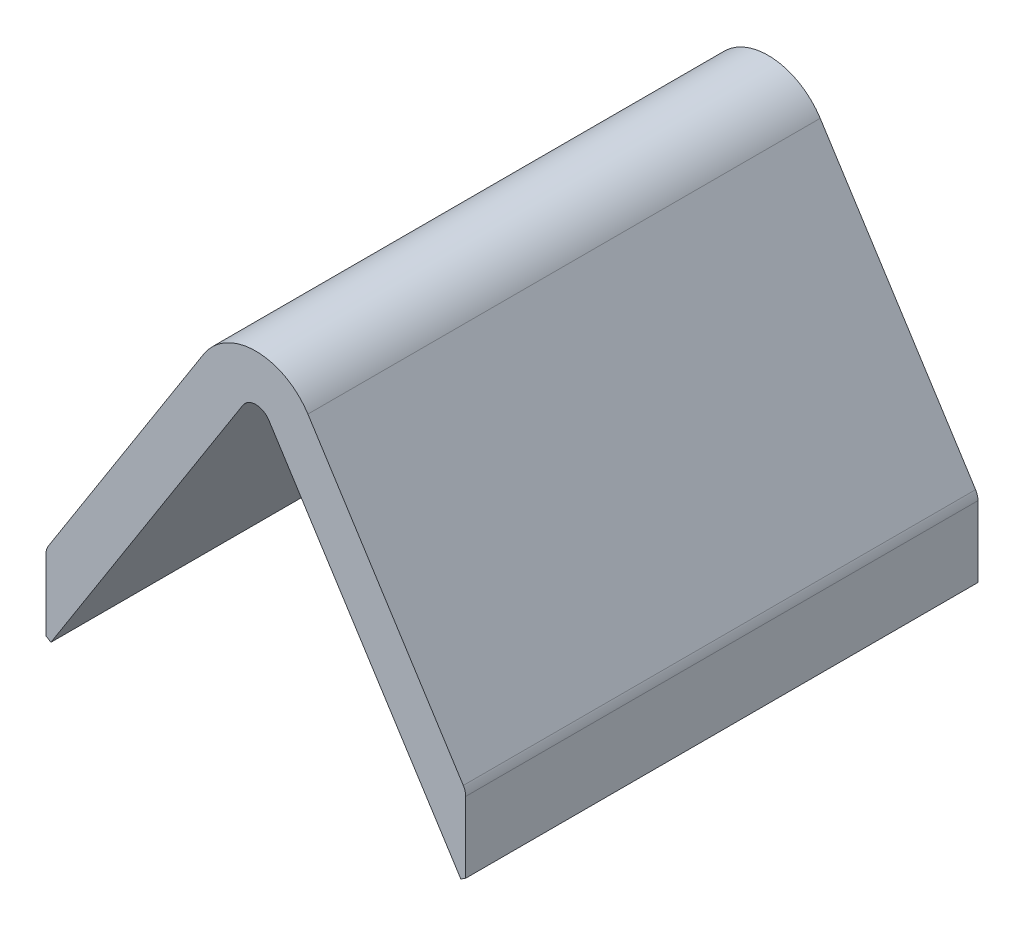
ISO-10303-21;
HEADER;
FILE_DESCRIPTION(('STEP AP214'),'2;1');
FILE_NAME('part.step','',(''),(''),'','','');
FILE_SCHEMA(('AUTOMOTIVE_DESIGN { 1 0 10303 214 1 1 1 1 }'));
ENDSEC;
DATA;
#1=APPLICATION_CONTEXT('core data for automotive mechanical design processes');
#2=APPLICATION_PROTOCOL_DEFINITION('international standard','automotive_design',2000,#1);
#3=PRODUCT_CONTEXT('',#1,'mechanical');
#4=PRODUCT('Part','Part','',(#3));
#5=PRODUCT_RELATED_PRODUCT_CATEGORY('part','',(#4));
#6=PRODUCT_DEFINITION_FORMATION('','',#4);
#7=PRODUCT_DEFINITION_CONTEXT('part definition',#1,'design');
#8=PRODUCT_DEFINITION('design','',#6,#7);
#9=PRODUCT_DEFINITION_SHAPE('','',#8);
#10=(LENGTH_UNIT() NAMED_UNIT(*) SI_UNIT(.MILLI.,.METRE.));
#11=(NAMED_UNIT(*) PLANE_ANGLE_UNIT() SI_UNIT($,.RADIAN.));
#12=(NAMED_UNIT(*) SI_UNIT($,.STERADIAN.) SOLID_ANGLE_UNIT());
#13=UNCERTAINTY_MEASURE_WITH_UNIT(LENGTH_MEASURE(1.E-05),#10,'distance_accuracy_value','');
#14=(GEOMETRIC_REPRESENTATION_CONTEXT(3) GLOBAL_UNCERTAINTY_ASSIGNED_CONTEXT((#13)) GLOBAL_UNIT_ASSIGNED_CONTEXT((#10,
#11,#12)) REPRESENTATION_CONTEXT('',''));
#15=CARTESIAN_POINT('',(0.,0.,0.));
#16=DIRECTION('',(0.,0.,1.));
#17=DIRECTION('',(1.,0.,0.));
#18=AXIS2_PLACEMENT_3D('',#15,#16,#17);
#19=CARTESIAN_POINT('',(63.0000000000001,37.527193592151,166.));
#20=DIRECTION('',(0.,0.,-1.));
#21=DIRECTION('',(-1.,0.,0.));
#22=AXIS2_PLACEMENT_3D('',#19,#20,#21);
#23=CYLINDRICAL_SURFACE('',#22,5.00000000000002);
#24=CARTESIAN_POINT('',(63.0000000000001,37.527193592151,0.));
#25=DIRECTION('',(0.,0.,1.));
#26=DIRECTION('',(1.,0.,0.));
#27=AXIS2_PLACEMENT_3D('',#24,#25,#26);
#28=CIRCLE('',#27,5.00000000000002);
#29=CARTESIAN_POINT('',(67.2169572290645,40.2136916338851,0.));
#30=VERTEX_POINT('',#29);
#31=CARTESIAN_POINT('',(68.0000000000001,37.527193592151,0.));
#32=VERTEX_POINT('',#31);
#33=EDGE_CURVE('E159',#30,#32,#28,.F.);
#34=ORIENTED_EDGE('',*,*,#33,.F.);
#35=DIRECTION('',(0.,0.,-1.));
#36=VECTOR('',#35,1.);
#37=CARTESIAN_POINT('',(67.2169572290645,40.2136916338851,166.));
#38=LINE('',#37,#36);
#39=CARTESIAN_POINT('',(67.2169572290645,40.2136916338851,166.));
#40=VERTEX_POINT('',#39);
#41=EDGE_CURVE('E11',#40,#30,#38,.T.);
#42=ORIENTED_EDGE('',*,*,#41,.F.);
#43=CARTESIAN_POINT('',(63.0000000000001,37.527193592151,166.));
#44=DIRECTION('',(0.,0.,1.));
#45=DIRECTION('',(1.,0.,0.));
#46=AXIS2_PLACEMENT_3D('',#43,#44,#45);
#47=CIRCLE('',#46,5.00000000000002);
#48=CARTESIAN_POINT('',(68.0000000000001,37.527193592151,166.));
#49=VERTEX_POINT('',#48);
#50=EDGE_CURVE('E189',#40,#49,#47,.F.);
#51=ORIENTED_EDGE('',*,*,#50,.T.);
#52=DIRECTION('',(0.,0.,-1.));
#53=VECTOR('',#52,1.);
#54=CARTESIAN_POINT('',(68.0000000000001,37.527193592151,166.));
#55=LINE('',#54,#53);
#56=EDGE_CURVE('E103',#49,#32,#55,.T.);
#57=ORIENTED_EDGE('',*,*,#56,.T.);
#58=EDGE_LOOP('',(#34,#42,#51,#57));
#59=FACE_BOUND('',#58,.T.);
#60=ADVANCED_FACE('F41',(#59),#23,.T.);
#61=CARTESIAN_POINT('',(66.0350263629959,42.068951467503,166.));
#62=DIRECTION('',(-0.843391445812888,-0.537299608346819,0.));
#63=DIRECTION('',(0.53729960834682,-0.843391445812889,0.));
#64=AXIS2_PLACEMENT_3D('',#61,#62,#63);
#65=PLANE('',#64);
#66=DIRECTION('',(-0.537299608346819,0.843391445812888,0.));
#67=VECTOR('',#66,1.);
#68=CARTESIAN_POINT('',(66.0350263629959,42.068951467503,0.));
#69=LINE('',#68,#67);
#70=CARTESIAN_POINT('',(16.8678289162579,119.245992166936,0.));
#71=VERTEX_POINT('',#70);
#72=EDGE_CURVE('E162',#30,#71,#69,.T.);
#73=ORIENTED_EDGE('',*,*,#72,.T.);
#74=DIRECTION('',(0.,0.,-1.));
#75=VECTOR('',#74,1.);
#76=CARTESIAN_POINT('',(16.8678289162579,119.245992166936,166.));
#77=LINE('',#76,#75);
#78=CARTESIAN_POINT('',(16.8678289162579,119.245992166936,166.));
#79=VERTEX_POINT('',#78);
#80=EDGE_CURVE('E49',#79,#71,#77,.T.);
#81=ORIENTED_EDGE('',*,*,#80,.F.);
#82=DIRECTION('',(-0.537299608346819,0.843391445812888,0.));
#83=VECTOR('',#82,1.);
#84=CARTESIAN_POINT('',(66.0350263629959,42.068951467503,166.));
#85=LINE('',#84,#83);
#86=EDGE_CURVE('E225',#40,#79,#85,.T.);
#87=ORIENTED_EDGE('',*,*,#86,.F.);
#88=ORIENTED_EDGE('',*,*,#41,.T.);
#89=EDGE_LOOP('',(#73,#81,#87,#88));
#90=FACE_BOUND('',#89,.T.);
#91=ADVANCED_FACE('F214',(#90),#65,.F.);
#92=CARTESIAN_POINT('',(0.,108.5,166.));
#93=DIRECTION('',(0.,0.,-1.));
#94=DIRECTION('',(-1.,0.,0.));
#95=AXIS2_PLACEMENT_3D('',#92,#93,#94);
#96=CYLINDRICAL_SURFACE('',#95,20.0000000000002);
#97=CARTESIAN_POINT('',(0.,108.5,0.));
#98=DIRECTION('',(0.,0.,1.));
#99=DIRECTION('',(1.,0.,0.));
#100=AXIS2_PLACEMENT_3D('',#97,#98,#99);
#101=CIRCLE('',#100,20.0000000000002);
#102=CARTESIAN_POINT('',(-16.8678289162579,119.245992166936,0.));
#103=VERTEX_POINT('',#102);
#104=EDGE_CURVE('E165',#103,#71,#101,.F.);
#105=ORIENTED_EDGE('',*,*,#104,.F.);
#106=DIRECTION('',(0.,0.,-1.));
#107=VECTOR('',#106,1.);
#108=CARTESIAN_POINT('',(-16.8678289162579,119.245992166936,166.));
#109=LINE('',#108,#107);
#110=CARTESIAN_POINT('',(-16.8678289162579,119.245992166936,166.));
#111=VERTEX_POINT('',#110);
#112=EDGE_CURVE('E204',#111,#103,#109,.T.);
#113=ORIENTED_EDGE('',*,*,#112,.F.);
#114=CARTESIAN_POINT('',(0.,108.5,166.));
#115=DIRECTION('',(0.,0.,1.));
#116=DIRECTION('',(1.,0.,0.));
#117=AXIS2_PLACEMENT_3D('',#114,#115,#116);
#118=CIRCLE('',#117,20.0000000000002);
#119=EDGE_CURVE('E211',#111,#79,#118,.F.);
#120=ORIENTED_EDGE('',*,*,#119,.T.);
#121=ORIENTED_EDGE('',*,*,#80,.T.);
#122=EDGE_LOOP('',(#105,#113,#120,#121));
#123=FACE_BOUND('',#122,.T.);
#124=ADVANCED_FACE('F209',(#123),#96,.T.);
#125=CARTESIAN_POINT('',(-66.0350263629959,42.0689514675029,166.));
#126=DIRECTION('',(-0.843391445812889,0.537299608346819,0.));
#127=DIRECTION('',(-0.537299608346819,-0.843391445812889,0.));
#128=AXIS2_PLACEMENT_3D('',#125,#126,#127);
#129=PLANE('',#128);
#130=DIRECTION('',(0.537299608346819,0.843391445812889,0.));
#131=VECTOR('',#130,1.);
#132=CARTESIAN_POINT('',(-66.0350263629959,42.0689514675029,0.));
#133=LINE('',#132,#131);
#134=CARTESIAN_POINT('',(-67.2169572290644,40.2136916338851,0.));
#135=VERTEX_POINT('',#134);
#136=EDGE_CURVE('E168',#135,#103,#133,.T.);
#137=ORIENTED_EDGE('',*,*,#136,.F.);
#138=DIRECTION('',(0.,0.,-1.));
#139=VECTOR('',#138,1.);
#140=CARTESIAN_POINT('',(-67.2169572290644,40.2136916338851,166.));
#141=LINE('',#140,#139);
#142=CARTESIAN_POINT('',(-67.2169572290644,40.2136916338851,166.));
#143=VERTEX_POINT('',#142);
#144=EDGE_CURVE('E202',#143,#135,#141,.T.);
#145=ORIENTED_EDGE('',*,*,#144,.F.);
#146=DIRECTION('',(0.537299608346819,0.843391445812889,0.));
#147=VECTOR('',#146,1.);
#148=CARTESIAN_POINT('',(-66.0350263629959,42.0689514675029,166.));
#149=LINE('',#148,#147);
#150=EDGE_CURVE('E224',#143,#111,#149,.T.);
#151=ORIENTED_EDGE('',*,*,#150,.T.);
#152=ORIENTED_EDGE('',*,*,#112,.T.);
#153=EDGE_LOOP('',(#137,#145,#151,#152));
#154=FACE_BOUND('',#153,.T.);
#155=ADVANCED_FACE('F220',(#154),#129,.T.);
#156=CARTESIAN_POINT('',(-63.,37.527193592151,166.));
#157=DIRECTION('',(0.,0.,-1.));
#158=DIRECTION('',(-1.,0.,0.));
#159=AXIS2_PLACEMENT_3D('',#156,#157,#158);
#160=CYLINDRICAL_SURFACE('',#159,5.00000000000002);
#161=CARTESIAN_POINT('',(-63.,37.527193592151,0.));
#162=DIRECTION('',(0.,0.,1.));
#163=DIRECTION('',(1.,0.,0.));
#164=AXIS2_PLACEMENT_3D('',#161,#162,#163);
#165=CIRCLE('',#164,5.00000000000002);
#166=CARTESIAN_POINT('',(-68.,37.527193592151,0.));
#167=VERTEX_POINT('',#166);
#168=EDGE_CURVE('E171',#135,#167,#165,.T.);
#169=ORIENTED_EDGE('',*,*,#168,.T.);
#170=DIRECTION('',(0.,0.,-1.));
#171=VECTOR('',#170,1.);
#172=CARTESIAN_POINT('',(-68.,37.527193592151,166.));
#173=LINE('',#172,#171);
#174=CARTESIAN_POINT('',(-68.,37.527193592151,166.));
#175=VERTEX_POINT('',#174);
#176=EDGE_CURVE('E200',#175,#167,#173,.T.);
#177=ORIENTED_EDGE('',*,*,#176,.F.);
#178=CARTESIAN_POINT('',(-63.,37.527193592151,166.));
#179=DIRECTION('',(0.,0.,1.));
#180=DIRECTION('',(1.,0.,0.));
#181=AXIS2_PLACEMENT_3D('',#178,#179,#180);
#182=CIRCLE('',#181,5.00000000000002);
#183=EDGE_CURVE('E227',#143,#175,#182,.T.);
#184=ORIENTED_EDGE('',*,*,#183,.F.);
#185=ORIENTED_EDGE('',*,*,#144,.T.);
#186=EDGE_LOOP('',(#169,#177,#184,#185));
#187=FACE_BOUND('',#186,.T.);
#188=ADVANCED_FACE('F262',(#187),#160,.T.);
#189=CARTESIAN_POINT('',(-68.,0.,166.));
#190=DIRECTION('',(-1.,0.,0.));
#191=DIRECTION('',(0.,-1.,0.));
#192=AXIS2_PLACEMENT_3D('',#189,#190,#191);
#193=PLANE('',#192);
#194=DIRECTION('',(0.,1.,0.));
#195=VECTOR('',#194,1.);
#196=CARTESIAN_POINT('',(-68.,0.,0.));
#197=LINE('',#196,#195);
#198=CARTESIAN_POINT('',(-68.,14.5576554865315,0.));
#199=VERTEX_POINT('',#198);
#200=EDGE_CURVE('E174',#199,#167,#197,.T.);
#201=ORIENTED_EDGE('',*,*,#200,.F.);
#202=DIRECTION('',(0.,0.,-1.));
#203=VECTOR('',#202,1.);
#204=CARTESIAN_POINT('',(-68.,14.5576554865315,166.));
#205=LINE('',#204,#203);
#206=CARTESIAN_POINT('',(-68.,14.5576554865315,166.));
#207=VERTEX_POINT('',#206);
#208=EDGE_CURVE('E198',#207,#199,#205,.T.);
#209=ORIENTED_EDGE('',*,*,#208,.F.);
#210=DIRECTION('',(0.,1.,0.));
#211=VECTOR('',#210,1.);
#212=CARTESIAN_POINT('',(-68.,0.,166.));
#213=LINE('',#212,#211);
#214=EDGE_CURVE('E233',#207,#175,#213,.T.);
#215=ORIENTED_EDGE('',*,*,#214,.T.);
#216=ORIENTED_EDGE('',*,*,#176,.T.);
#217=EDGE_LOOP('',(#201,#209,#215,#216));
#218=FACE_BOUND('',#217,.T.);
#219=ADVANCED_FACE('F265',(#218),#193,.T.);
#220=CARTESIAN_POINT('',(-13.0341208365957,-20.4594714876111,166.));
#221=DIRECTION('',(-0.537299608346819,-0.843391445812889,0.));
#222=DIRECTION('',(0.843391445812889,-0.537299608346819,0.));
#223=AXIS2_PLACEMENT_3D('',#220,#221,#222);
#224=PLANE('',#223);
#225=DIRECTION('',(-0.843391445812889,0.537299608346819,0.));
#226=VECTOR('',#225,1.);
#227=CARTESIAN_POINT('',(-13.0341208365957,-20.4594714876111,0.));
#228=LINE('',#227,#226);
#229=CARTESIAN_POINT('',(-66.4182755123982,13.5499858546894,0.));
#230=VERTEX_POINT('',#229);
#231=EDGE_CURVE('E177',#230,#199,#228,.T.);
#232=ORIENTED_EDGE('',*,*,#231,.F.);
#233=DIRECTION('',(0.,0.,-1.));
#234=VECTOR('',#233,1.);
#235=CARTESIAN_POINT('',(-66.4182755123982,13.5499858546894,166.));
#236=LINE('',#235,#234);
#237=CARTESIAN_POINT('',(-66.4182755123982,13.5499858546894,166.));
#238=VERTEX_POINT('',#237);
#239=EDGE_CURVE('E196',#238,#230,#236,.T.);
#240=ORIENTED_EDGE('',*,*,#239,.F.);
#241=DIRECTION('',(-0.843391445812889,0.537299608346819,0.));
#242=VECTOR('',#241,1.);
#243=CARTESIAN_POINT('',(-13.0341208365957,-20.4594714876111,166.));
#244=LINE('',#243,#242);
#245=EDGE_CURVE('E236',#238,#207,#244,.T.);
#246=ORIENTED_EDGE('',*,*,#245,.T.);
#247=ORIENTED_EDGE('',*,*,#208,.T.);
#248=EDGE_LOOP('',(#232,#240,#246,#247));
#249=FACE_BOUND('',#248,.T.);
#250=ADVANCED_FACE('F269',(#249),#224,.T.);
#251=CARTESIAN_POINT('',(-53.3841546758025,34.0094573423006,166.));
#252=DIRECTION('',(-0.843391445812889,0.537299608346818,0.));
#253=DIRECTION('',(-0.537299608346818,-0.843391445812889,0.));
#254=AXIS2_PLACEMENT_3D('',#251,#252,#253);
#255=PLANE('',#254);
#256=DIRECTION('',(0.537299608346818,0.843391445812889,0.));
#257=VECTOR('',#256,1.);
#258=CARTESIAN_POINT('',(-53.3841546758025,34.0094573423006,0.));
#259=LINE('',#258,#257);
#260=CARTESIAN_POINT('',(-4.21695722906457,111.186498041734,0.));
#261=VERTEX_POINT('',#260);
#262=EDGE_CURVE('E180',#230,#261,#259,.T.);
#263=ORIENTED_EDGE('',*,*,#262,.T.);
#264=DIRECTION('',(0.,0.,-1.));
#265=VECTOR('',#264,1.);
#266=CARTESIAN_POINT('',(-4.21695722906457,111.186498041734,166.));
#267=LINE('',#266,#265);
#268=CARTESIAN_POINT('',(-4.21695722906457,111.186498041734,166.));
#269=VERTEX_POINT('',#268);
#270=EDGE_CURVE('E193',#269,#261,#267,.T.);
#271=ORIENTED_EDGE('',*,*,#270,.F.);
#272=DIRECTION('',(0.537299608346818,0.843391445812889,0.));
#273=VECTOR('',#272,1.);
#274=CARTESIAN_POINT('',(-53.3841546758025,34.0094573423006,166.));
#275=LINE('',#274,#273);
#276=EDGE_CURVE('E154',#238,#269,#275,.T.);
#277=ORIENTED_EDGE('',*,*,#276,.F.);
#278=ORIENTED_EDGE('',*,*,#239,.T.);
#279=EDGE_LOOP('',(#263,#271,#277,#278));
#280=FACE_BOUND('',#279,.T.);
#281=ADVANCED_FACE('F243',(#280),#255,.F.);
#282=CARTESIAN_POINT('',(0.,108.5,166.));
#283=DIRECTION('',(0.,0.,-1.));
#284=DIRECTION('',(-1.,0.,0.));
#285=AXIS2_PLACEMENT_3D('',#282,#283,#284);
#286=CYLINDRICAL_SURFACE('',#285,5.00000000000014);
#287=CARTESIAN_POINT('',(0.,108.5,0.));
#288=DIRECTION('',(0.,0.,1.));
#289=DIRECTION('',(1.,0.,0.));
#290=AXIS2_PLACEMENT_3D('',#287,#288,#289);
#291=CIRCLE('',#290,5.00000000000014);
#292=CARTESIAN_POINT('',(4.21695722906461,111.186498041734,0.));
#293=VERTEX_POINT('',#292);
#294=EDGE_CURVE('E182',#261,#293,#291,.F.);
#295=ORIENTED_EDGE('',*,*,#294,.T.);
#296=DIRECTION('',(0.,0.,-1.));
#297=VECTOR('',#296,1.);
#298=CARTESIAN_POINT('',(4.21695722906461,111.186498041734,166.));
#299=LINE('',#298,#297);
#300=CARTESIAN_POINT('',(4.21695722906461,111.186498041734,166.));
#301=VERTEX_POINT('',#300);
#302=EDGE_CURVE('E143',#301,#293,#299,.T.);
#303=ORIENTED_EDGE('',*,*,#302,.F.);
#304=CARTESIAN_POINT('',(0.,108.5,166.));
#305=DIRECTION('',(0.,0.,1.));
#306=DIRECTION('',(1.,0.,0.));
#307=AXIS2_PLACEMENT_3D('',#304,#305,#306);
#308=CIRCLE('',#307,5.00000000000014);
#309=EDGE_CURVE('E151',#269,#301,#308,.F.);
#310=ORIENTED_EDGE('',*,*,#309,.F.);
#311=ORIENTED_EDGE('',*,*,#270,.T.);
#312=EDGE_LOOP('',(#295,#303,#310,#311));
#313=FACE_BOUND('',#312,.T.);
#314=ADVANCED_FACE('F247',(#313),#286,.F.);
#315=CARTESIAN_POINT('',(53.3841546758026,34.0094573423006,166.));
#316=DIRECTION('',(-0.843391445812889,-0.537299608346818,0.));
#317=DIRECTION('',(0.537299608346818,-0.843391445812889,0.));
#318=AXIS2_PLACEMENT_3D('',#315,#316,#317);
#319=PLANE('',#318);
#320=DIRECTION('',(-0.537299608346818,0.843391445812889,0.));
#321=VECTOR('',#320,1.);
#322=CARTESIAN_POINT('',(53.3841546758026,34.0094573423006,0.));
#323=LINE('',#322,#321);
#324=CARTESIAN_POINT('',(66.4182755123983,13.5499858546895,0.));
#325=VERTEX_POINT('',#324);
#326=EDGE_CURVE('E142',#325,#293,#323,.T.);
#327=ORIENTED_EDGE('',*,*,#326,.F.);
#328=DIRECTION('',(0.,0.,-1.));
#329=VECTOR('',#328,1.);
#330=CARTESIAN_POINT('',(66.4182755123983,13.5499858546895,166.));
#331=LINE('',#330,#329);
#332=CARTESIAN_POINT('',(66.4182755123983,13.5499858546895,166.));
#333=VERTEX_POINT('',#332);
#334=EDGE_CURVE('E136',#333,#325,#331,.T.);
#335=ORIENTED_EDGE('',*,*,#334,.F.);
#336=DIRECTION('',(-0.537299608346818,0.843391445812889,0.));
#337=VECTOR('',#336,1.);
#338=CARTESIAN_POINT('',(53.3841546758026,34.0094573423006,166.));
#339=LINE('',#338,#337);
#340=EDGE_CURVE('E140',#333,#301,#339,.T.);
#341=ORIENTED_EDGE('',*,*,#340,.T.);
#342=ORIENTED_EDGE('',*,*,#302,.T.);
#343=EDGE_LOOP('',(#327,#335,#341,#342));
#344=FACE_BOUND('',#343,.T.);
#345=ADVANCED_FACE('F138',(#344),#319,.T.);
#346=CARTESIAN_POINT('',(13.0341208365957,-20.4594714876112,166.));
#347=DIRECTION('',(-0.537299608346819,0.843391445812889,0.));
#348=DIRECTION('',(-0.843391445812889,-0.537299608346819,0.));
#349=AXIS2_PLACEMENT_3D('',#346,#347,#348);
#350=PLANE('',#349);
#351=DIRECTION('',(0.843391445812889,0.537299608346819,0.));
#352=VECTOR('',#351,1.);
#353=CARTESIAN_POINT('',(13.0341208365957,-20.4594714876112,0.));
#354=LINE('',#353,#352);
#355=CARTESIAN_POINT('',(68.,14.5576554865315,0.));
#356=VERTEX_POINT('',#355);
#357=EDGE_CURVE('E96',#325,#356,#354,.T.);
#358=ORIENTED_EDGE('',*,*,#357,.T.);
#359=DIRECTION('',(0.,0.,-1.));
#360=VECTOR('',#359,1.);
#361=CARTESIAN_POINT('',(68.,14.5576554865315,166.));
#362=LINE('',#361,#360);
#363=CARTESIAN_POINT('',(68.,14.5576554865315,166.));
#364=VERTEX_POINT('',#363);
#365=EDGE_CURVE('E144',#364,#356,#362,.T.);
#366=ORIENTED_EDGE('',*,*,#365,.F.);
#367=DIRECTION('',(0.843391445812889,0.537299608346819,0.));
#368=VECTOR('',#367,1.);
#369=CARTESIAN_POINT('',(13.0341208365957,-20.4594714876112,166.));
#370=LINE('',#369,#368);
#371=EDGE_CURVE('E146',#333,#364,#370,.T.);
#372=ORIENTED_EDGE('',*,*,#371,.F.);
#373=ORIENTED_EDGE('',*,*,#334,.T.);
#374=EDGE_LOOP('',(#358,#366,#372,#373));
#375=FACE_BOUND('',#374,.T.);
#376=ADVANCED_FACE('F147',(#375),#350,.F.);
#377=CARTESIAN_POINT('',(67.9999999999999,-2.87590763303314E-13,166.));
#378=DIRECTION('',(-1.,0.,0.));
#379=DIRECTION('',(0.,-1.,0.));
#380=AXIS2_PLACEMENT_3D('',#377,#378,#379);
#381=PLANE('',#380);
#382=DIRECTION('',(0.,1.,0.));
#383=VECTOR('',#382,1.);
#384=CARTESIAN_POINT('',(67.9999999999999,-2.87590763303314E-13,0.));
#385=LINE('',#384,#383);
#386=EDGE_CURVE('E187',#356,#32,#385,.T.);
#387=ORIENTED_EDGE('',*,*,#386,.T.);
#388=ORIENTED_EDGE('',*,*,#56,.F.);
#389=DIRECTION('',(0.,1.,0.));
#390=VECTOR('',#389,1.);
#391=CARTESIAN_POINT('',(67.9999999999999,-2.87590763303314E-13,166.));
#392=LINE('',#391,#390);
#393=EDGE_CURVE('E57',#364,#49,#392,.T.);
#394=ORIENTED_EDGE('',*,*,#393,.F.);
#395=ORIENTED_EDGE('',*,*,#365,.T.);
#396=EDGE_LOOP('',(#387,#388,#394,#395));
#397=FACE_BOUND('',#396,.T.);
#398=ADVANCED_FACE('F250',(#397),#381,.F.);
#399=CARTESIAN_POINT('',(0.,0.,166.));
#400=DIRECTION('',(0.,0.,1.));
#401=DIRECTION('',(1.,0.,0.));
#402=AXIS2_PLACEMENT_3D('',#399,#400,#401);
#403=PLANE('',#402);
#404=ORIENTED_EDGE('',*,*,#50,.F.);
#405=ORIENTED_EDGE('',*,*,#86,.T.);
#406=ORIENTED_EDGE('',*,*,#119,.F.);
#407=ORIENTED_EDGE('',*,*,#150,.F.);
#408=ORIENTED_EDGE('',*,*,#183,.T.);
#409=ORIENTED_EDGE('',*,*,#214,.F.);
#410=ORIENTED_EDGE('',*,*,#245,.F.);
#411=ORIENTED_EDGE('',*,*,#276,.T.);
#412=ORIENTED_EDGE('',*,*,#309,.T.);
#413=ORIENTED_EDGE('',*,*,#340,.F.);
#414=ORIENTED_EDGE('',*,*,#371,.T.);
#415=ORIENTED_EDGE('',*,*,#393,.T.);
#416=EDGE_LOOP('',(#404,#405,#406,#407,#408,#409,#410,#411,#412,#413,#414,#415));
#417=FACE_BOUND('',#416,.T.);
#418=ADVANCED_FACE('F149',(#417),#403,.T.);
#419=CARTESIAN_POINT('',(0.,0.,0.));
#420=DIRECTION('',(0.,0.,1.));
#421=DIRECTION('',(1.,0.,0.));
#422=AXIS2_PLACEMENT_3D('',#419,#420,#421);
#423=PLANE('',#422);
#424=ORIENTED_EDGE('',*,*,#33,.T.);
#425=ORIENTED_EDGE('',*,*,#386,.F.);
#426=ORIENTED_EDGE('',*,*,#357,.F.);
#427=ORIENTED_EDGE('',*,*,#326,.T.);
#428=ORIENTED_EDGE('',*,*,#294,.F.);
#429=ORIENTED_EDGE('',*,*,#262,.F.);
#430=ORIENTED_EDGE('',*,*,#231,.T.);
#431=ORIENTED_EDGE('',*,*,#200,.T.);
#432=ORIENTED_EDGE('',*,*,#168,.F.);
#433=ORIENTED_EDGE('',*,*,#136,.T.);
#434=ORIENTED_EDGE('',*,*,#104,.T.);
#435=ORIENTED_EDGE('',*,*,#72,.F.);
#436=EDGE_LOOP('',(#424,#425,#426,#427,#428,#429,#430,#431,#432,#433,#434,#435));
#437=FACE_BOUND('',#436,.T.);
#438=ADVANCED_FACE('F216',(#437),#423,.F.);
#439=CLOSED_SHELL('',(#60,#91,#124,#155,#188,#219,#250,#281,#314,#345,#376,#398,#418,#438));
#440=MANIFOLD_SOLID_BREP('B2',#439);
#441=ADVANCED_BREP_SHAPE_REPRESENTATION('',(#18,#440),#14);
#442=SHAPE_DEFINITION_REPRESENTATION(#9,#441);
ENDSEC;
END-ISO-10303-21;
